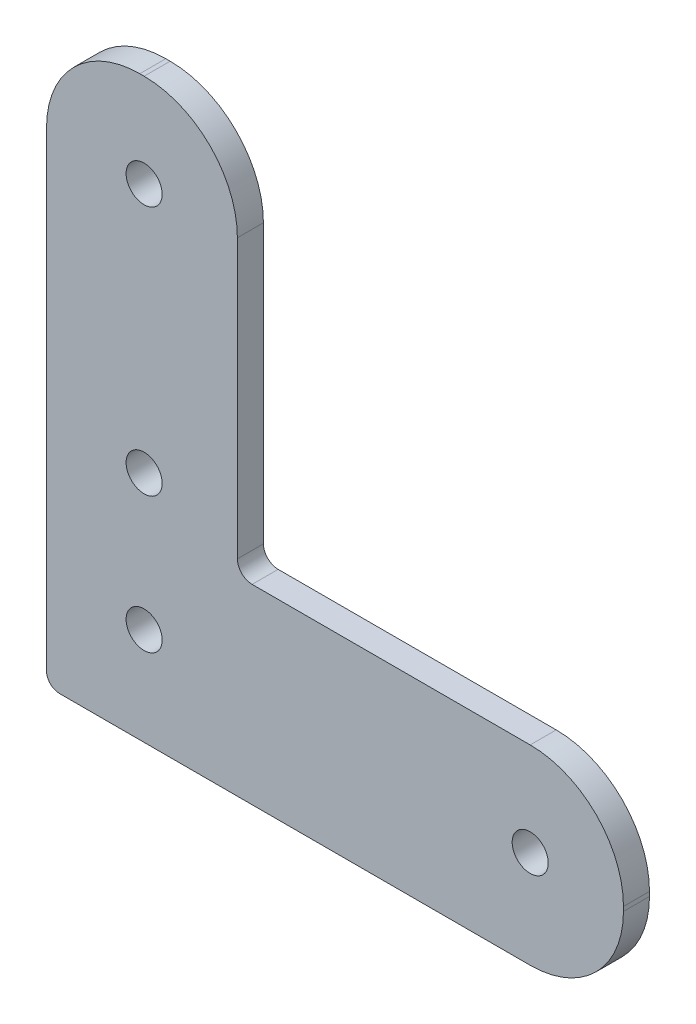
ISO-10303-21;
HEADER;
FILE_DESCRIPTION(('STEP AP214'),'2;1');
FILE_NAME('part.step','',(''),(''),'','','');
FILE_SCHEMA(('AUTOMOTIVE_DESIGN { 1 0 10303 214 1 1 1 1 }'));
ENDSEC;
DATA;
#1=APPLICATION_CONTEXT('core data for automotive mechanical design processes');
#2=APPLICATION_PROTOCOL_DEFINITION('international standard','automotive_design',2000,#1);
#3=PRODUCT_CONTEXT('',#1,'mechanical');
#4=PRODUCT('Part','Part','',(#3));
#5=PRODUCT_RELATED_PRODUCT_CATEGORY('part','',(#4));
#6=PRODUCT_DEFINITION_FORMATION('','',#4);
#7=PRODUCT_DEFINITION_CONTEXT('part definition',#1,'design');
#8=PRODUCT_DEFINITION('design','',#6,#7);
#9=PRODUCT_DEFINITION_SHAPE('','',#8);
#10=(LENGTH_UNIT() NAMED_UNIT(*) SI_UNIT(.MILLI.,.METRE.));
#11=(NAMED_UNIT(*) PLANE_ANGLE_UNIT() SI_UNIT($,.RADIAN.));
#12=(NAMED_UNIT(*) SI_UNIT($,.STERADIAN.) SOLID_ANGLE_UNIT());
#13=UNCERTAINTY_MEASURE_WITH_UNIT(LENGTH_MEASURE(1.E-05),#10,'distance_accuracy_value','');
#14=(GEOMETRIC_REPRESENTATION_CONTEXT(3) GLOBAL_UNCERTAINTY_ASSIGNED_CONTEXT((#13)) GLOBAL_UNIT_ASSIGNED_CONTEXT((#10,
#11,#12)) REPRESENTATION_CONTEXT('',''));
#15=CARTESIAN_POINT('',(0.,0.,0.));
#16=DIRECTION('',(0.,0.,1.));
#17=DIRECTION('',(1.,0.,0.));
#18=AXIS2_PLACEMENT_3D('',#15,#16,#17);
#19=CARTESIAN_POINT('',(0.,44.,3.));
#20=DIRECTION('',(0.,1.,0.));
#21=DIRECTION('',(0.,0.,1.));
#22=AXIS2_PLACEMENT_3D('',#19,#20,#21);
#23=PLANE('',#22);
#24=DIRECTION('',(1.,0.,0.));
#25=VECTOR('',#24,1.);
#26=CARTESIAN_POINT('',(0.,44.,-3.));
#27=LINE('',#26,#25);
#28=CARTESIAN_POINT('',(47.4,44.,-3.));
#29=VERTEX_POINT('',#28);
#30=CARTESIAN_POINT('',(111.5,44.,-3.));
#31=VERTEX_POINT('',#30);
#32=EDGE_CURVE('E128',#29,#31,#27,.T.);
#33=ORIENTED_EDGE('',*,*,#32,.F.);
#34=DIRECTION('',(0.,0.,-1.));
#35=VECTOR('',#34,1.);
#36=CARTESIAN_POINT('',(47.4,44.,3.));
#37=LINE('',#36,#35);
#38=CARTESIAN_POINT('',(47.4,44.,3.));
#39=VERTEX_POINT('',#38);
#40=EDGE_CURVE('E196',#29,#39,#37,.F.);
#41=ORIENTED_EDGE('',*,*,#40,.T.);
#42=DIRECTION('',(1.,0.,0.));
#43=VECTOR('',#42,1.);
#44=CARTESIAN_POINT('',(0.,44.,3.));
#45=LINE('',#44,#43);
#46=CARTESIAN_POINT('',(111.5,44.,3.));
#47=VERTEX_POINT('',#46);
#48=EDGE_CURVE('E153',#39,#47,#45,.T.);
#49=ORIENTED_EDGE('',*,*,#48,.T.);
#50=DIRECTION('',(0.,0.,-1.));
#51=VECTOR('',#50,1.);
#52=CARTESIAN_POINT('',(111.5,44.,3.));
#53=LINE('',#52,#51);
#54=EDGE_CURVE('E147',#47,#31,#53,.T.);
#55=ORIENTED_EDGE('',*,*,#54,.T.);
#56=EDGE_LOOP('',(#33,#41,#49,#55));
#57=FACE_BOUND('',#56,.T.);
#58=ADVANCED_FACE('F43',(#57),#23,.T.);
#59=CARTESIAN_POINT('',(44.,0.,3.));
#60=DIRECTION('',(1.,0.,0.));
#61=DIRECTION('',(0.,1.,0.));
#62=AXIS2_PLACEMENT_3D('',#59,#60,#61);
#63=PLANE('',#62);
#64=DIRECTION('',(0.,-1.,0.));
#65=VECTOR('',#64,1.);
#66=CARTESIAN_POINT('',(44.,0.,3.));
#67=LINE('',#66,#65);
#68=CARTESIAN_POINT('',(44.,111.5,3.));
#69=VERTEX_POINT('',#68);
#70=CARTESIAN_POINT('',(44.,47.4,3.));
#71=VERTEX_POINT('',#70);
#72=EDGE_CURVE('E227',#69,#71,#67,.T.);
#73=ORIENTED_EDGE('',*,*,#72,.T.);
#74=DIRECTION('',(0.,0.,-1.));
#75=VECTOR('',#74,1.);
#76=CARTESIAN_POINT('',(44.,47.4,-3.));
#77=LINE('',#76,#75);
#78=CARTESIAN_POINT('',(44.,47.4,-3.));
#79=VERTEX_POINT('',#78);
#80=EDGE_CURVE('E193',#71,#79,#77,.T.);
#81=ORIENTED_EDGE('',*,*,#80,.T.);
#82=DIRECTION('',(0.,-1.,0.));
#83=VECTOR('',#82,1.);
#84=CARTESIAN_POINT('',(44.,0.,-3.));
#85=LINE('',#84,#83);
#86=CARTESIAN_POINT('',(44.,111.5,-3.));
#87=VERTEX_POINT('',#86);
#88=EDGE_CURVE('E139',#87,#79,#85,.T.);
#89=ORIENTED_EDGE('',*,*,#88,.F.);
#90=DIRECTION('',(0.,0.,-1.));
#91=VECTOR('',#90,1.);
#92=CARTESIAN_POINT('',(44.,111.5,3.));
#93=LINE('',#92,#91);
#94=EDGE_CURVE('E188',#87,#69,#93,.F.);
#95=ORIENTED_EDGE('',*,*,#94,.T.);
#96=EDGE_LOOP('',(#73,#81,#89,#95));
#97=FACE_BOUND('',#96,.T.);
#98=ADVANCED_FACE('F284',(#97),#63,.T.);
#99=CARTESIAN_POINT('',(0.,133.,3.));
#100=DIRECTION('',(0.,-1.,0.));
#101=DIRECTION('',(0.,0.,-1.));
#102=AXIS2_PLACEMENT_3D('',#99,#100,#101);
#103=PLANE('',#102);
#104=DIRECTION('',(-1.,0.,0.));
#105=VECTOR('',#104,1.);
#106=CARTESIAN_POINT('',(0.,133.,3.));
#107=LINE('',#106,#105);
#108=CARTESIAN_POINT('',(22.5,133.,3.));
#109=VERTEX_POINT('',#108);
#110=CARTESIAN_POINT('',(21.5,133.,3.));
#111=VERTEX_POINT('',#110);
#112=EDGE_CURVE('E224',#109,#111,#107,.T.);
#113=ORIENTED_EDGE('',*,*,#112,.F.);
#114=DIRECTION('',(0.,0.,-1.));
#115=VECTOR('',#114,1.);
#116=CARTESIAN_POINT('',(22.5,133.,-3.));
#117=LINE('',#116,#115);
#118=CARTESIAN_POINT('',(22.5,133.,-3.));
#119=VERTEX_POINT('',#118);
#120=EDGE_CURVE('E185',#109,#119,#117,.T.);
#121=ORIENTED_EDGE('',*,*,#120,.T.);
#122=DIRECTION('',(-1.,0.,0.));
#123=VECTOR('',#122,1.);
#124=CARTESIAN_POINT('',(0.,133.,-3.));
#125=LINE('',#124,#123);
#126=CARTESIAN_POINT('',(21.5,133.,-3.));
#127=VERTEX_POINT('',#126);
#128=EDGE_CURVE('E215',#119,#127,#125,.T.);
#129=ORIENTED_EDGE('',*,*,#128,.T.);
#130=DIRECTION('',(0.,0.,-1.));
#131=VECTOR('',#130,1.);
#132=CARTESIAN_POINT('',(21.5,133.,3.));
#133=LINE('',#132,#131);
#134=EDGE_CURVE('E183',#127,#111,#133,.F.);
#135=ORIENTED_EDGE('',*,*,#134,.T.);
#136=EDGE_LOOP('',(#113,#121,#129,#135));
#137=FACE_BOUND('',#136,.T.);
#138=ADVANCED_FACE('F290',(#137),#103,.F.);
#139=CARTESIAN_POINT('',(0.,0.,3.));
#140=DIRECTION('',(-1.,0.,0.));
#141=DIRECTION('',(0.,0.,1.));
#142=AXIS2_PLACEMENT_3D('',#139,#140,#141);
#143=PLANE('',#142);
#144=DIRECTION('',(0.,1.,0.));
#145=VECTOR('',#144,1.);
#146=CARTESIAN_POINT('',(0.,0.,-3.));
#147=LINE('',#146,#145);
#148=CARTESIAN_POINT('',(0.,3.,-3.));
#149=VERTEX_POINT('',#148);
#150=CARTESIAN_POINT('',(0.,111.5,-3.));
#151=VERTEX_POINT('',#150);
#152=EDGE_CURVE('E214',#149,#151,#147,.T.);
#153=ORIENTED_EDGE('',*,*,#152,.F.);
#154=DIRECTION('',(0.,0.,-1.));
#155=VECTOR('',#154,1.);
#156=CARTESIAN_POINT('',(0.,3.,3.));
#157=LINE('',#156,#155);
#158=CARTESIAN_POINT('',(0.,3.,3.));
#159=VERTEX_POINT('',#158);
#160=EDGE_CURVE('E51',#149,#159,#157,.F.);
#161=ORIENTED_EDGE('',*,*,#160,.T.);
#162=DIRECTION('',(0.,1.,0.));
#163=VECTOR('',#162,1.);
#164=CARTESIAN_POINT('',(0.,0.,3.));
#165=LINE('',#164,#163);
#166=CARTESIAN_POINT('',(0.,111.5,3.));
#167=VERTEX_POINT('',#166);
#168=EDGE_CURVE('E222',#159,#167,#165,.T.);
#169=ORIENTED_EDGE('',*,*,#168,.T.);
#170=DIRECTION('',(0.,0.,-1.));
#171=VECTOR('',#170,1.);
#172=CARTESIAN_POINT('',(0.,111.5,-3.));
#173=LINE('',#172,#171);
#174=EDGE_CURVE('E190',#167,#151,#173,.T.);
#175=ORIENTED_EDGE('',*,*,#174,.T.);
#176=EDGE_LOOP('',(#153,#161,#169,#175));
#177=FACE_BOUND('',#176,.T.);
#178=ADVANCED_FACE('F310',(#177),#143,.T.);
#179=CARTESIAN_POINT('',(0.,0.,3.));
#180=DIRECTION('',(0.,-1.,0.));
#181=DIRECTION('',(1.,0.,0.));
#182=AXIS2_PLACEMENT_3D('',#179,#180,#181);
#183=PLANE('',#182);
#184=DIRECTION('',(-1.,0.,0.));
#185=VECTOR('',#184,1.);
#186=CARTESIAN_POINT('',(0.,0.,3.));
#187=LINE('',#186,#185);
#188=CARTESIAN_POINT('',(111.5,0.,3.));
#189=VERTEX_POINT('',#188);
#190=CARTESIAN_POINT('',(3.,0.,3.));
#191=VERTEX_POINT('',#190);
#192=EDGE_CURVE('E161',#189,#191,#187,.T.);
#193=ORIENTED_EDGE('',*,*,#192,.T.);
#194=DIRECTION('',(0.,0.,-1.));
#195=VECTOR('',#194,1.);
#196=CARTESIAN_POINT('',(3.,0.,3.));
#197=LINE('',#196,#195);
#198=CARTESIAN_POINT('',(3.,0.,-3.));
#199=VERTEX_POINT('',#198);
#200=EDGE_CURVE('E201',#191,#199,#197,.T.);
#201=ORIENTED_EDGE('',*,*,#200,.T.);
#202=DIRECTION('',(-1.,0.,0.));
#203=VECTOR('',#202,1.);
#204=CARTESIAN_POINT('',(0.,0.,-3.));
#205=LINE('',#204,#203);
#206=CARTESIAN_POINT('',(111.5,0.,-3.));
#207=VERTEX_POINT('',#206);
#208=EDGE_CURVE('E209',#207,#199,#205,.T.);
#209=ORIENTED_EDGE('',*,*,#208,.F.);
#210=DIRECTION('',(0.,0.,-1.));
#211=VECTOR('',#210,1.);
#212=CARTESIAN_POINT('',(111.5,0.,3.));
#213=LINE('',#212,#211);
#214=EDGE_CURVE('E181',#207,#189,#213,.F.);
#215=ORIENTED_EDGE('',*,*,#214,.T.);
#216=EDGE_LOOP('',(#193,#201,#209,#215));
#217=FACE_BOUND('',#216,.T.);
#218=ADVANCED_FACE('F208',(#217),#183,.T.);
#219=CARTESIAN_POINT('',(133.,0.,3.));
#220=DIRECTION('',(1.,0.,0.));
#221=DIRECTION('',(0.,0.,-1.));
#222=AXIS2_PLACEMENT_3D('',#219,#220,#221);
#223=PLANE('',#222);
#224=DIRECTION('',(0.,-1.,0.));
#225=VECTOR('',#224,1.);
#226=CARTESIAN_POINT('',(133.,0.,-3.));
#227=LINE('',#226,#225);
#228=CARTESIAN_POINT('',(133.,22.5,-3.));
#229=VERTEX_POINT('',#228);
#230=CARTESIAN_POINT('',(133.,21.5,-3.));
#231=VERTEX_POINT('',#230);
#232=EDGE_CURVE('E164',#229,#231,#227,.T.);
#233=ORIENTED_EDGE('',*,*,#232,.F.);
#234=DIRECTION('',(0.,0.,-1.));
#235=VECTOR('',#234,1.);
#236=CARTESIAN_POINT('',(133.,22.5,3.));
#237=LINE('',#236,#235);
#238=CARTESIAN_POINT('',(133.,22.5,3.));
#239=VERTEX_POINT('',#238);
#240=EDGE_CURVE('E148',#229,#239,#237,.F.);
#241=ORIENTED_EDGE('',*,*,#240,.T.);
#242=DIRECTION('',(0.,-1.,0.));
#243=VECTOR('',#242,1.);
#244=CARTESIAN_POINT('',(133.,0.,3.));
#245=LINE('',#244,#243);
#246=CARTESIAN_POINT('',(133.,21.5,3.));
#247=VERTEX_POINT('',#246);
#248=EDGE_CURVE('E156',#239,#247,#245,.T.);
#249=ORIENTED_EDGE('',*,*,#248,.T.);
#250=DIRECTION('',(0.,0.,-1.));
#251=VECTOR('',#250,1.);
#252=CARTESIAN_POINT('',(133.,21.5,3.));
#253=LINE('',#252,#251);
#254=EDGE_CURVE('E149',#247,#231,#253,.T.);
#255=ORIENTED_EDGE('',*,*,#254,.T.);
#256=EDGE_LOOP('',(#233,#241,#249,#255));
#257=FACE_BOUND('',#256,.T.);
#258=ADVANCED_FACE('F260',(#257),#223,.T.);
#259=CARTESIAN_POINT('',(0.,0.,3.));
#260=DIRECTION('',(0.,0.,1.));
#261=DIRECTION('',(1.,0.,0.));
#262=AXIS2_PLACEMENT_3D('',#259,#260,#261);
#263=PLANE('',#262);
#264=CARTESIAN_POINT('',(22.5,111.5,3.));
#265=DIRECTION('',(0.,0.,1.));
#266=DIRECTION('',(1.,0.,0.));
#267=AXIS2_PLACEMENT_3D('',#264,#265,#266);
#268=CIRCLE('',#267,4.15925);
#269=CARTESIAN_POINT('',(26.65925,111.5,3.));
#270=VERTEX_POINT('',#269);
#271=EDGE_CURVE('E251',#270,#270,#268,.T.);
#272=ORIENTED_EDGE('',*,*,#271,.F.);
#273=EDGE_LOOP('',(#272));
#274=FACE_BOUND('',#273,.T.);
#275=CARTESIAN_POINT('',(22.5,53.7884,3.));
#276=DIRECTION('',(0.,0.,1.));
#277=DIRECTION('',(1.,0.,0.));
#278=AXIS2_PLACEMENT_3D('',#275,#276,#277);
#279=CIRCLE('',#278,4.15925);
#280=CARTESIAN_POINT('',(26.65925,53.7884,3.));
#281=VERTEX_POINT('',#280);
#282=EDGE_CURVE('E245',#281,#281,#279,.T.);
#283=ORIENTED_EDGE('',*,*,#282,.F.);
#284=EDGE_LOOP('',(#283));
#285=FACE_BOUND('',#284,.T.);
#286=CARTESIAN_POINT('',(22.5,22.5,3.));
#287=DIRECTION('',(0.,0.,1.));
#288=DIRECTION('',(1.,0.,0.));
#289=AXIS2_PLACEMENT_3D('',#286,#287,#288);
#290=CIRCLE('',#289,4.15925);
#291=CARTESIAN_POINT('',(26.65925,22.5,3.));
#292=VERTEX_POINT('',#291);
#293=EDGE_CURVE('E239',#292,#292,#290,.T.);
#294=ORIENTED_EDGE('',*,*,#293,.F.);
#295=EDGE_LOOP('',(#294));
#296=FACE_BOUND('',#295,.T.);
#297=CARTESIAN_POINT('',(111.5,22.5,3.));
#298=DIRECTION('',(0.,0.,1.));
#299=DIRECTION('',(1.,0.,0.));
#300=AXIS2_PLACEMENT_3D('',#297,#298,#299);
#301=CIRCLE('',#300,4.15925);
#302=CARTESIAN_POINT('',(115.65925,22.5,3.));
#303=VERTEX_POINT('',#302);
#304=EDGE_CURVE('E233',#303,#303,#301,.T.);
#305=ORIENTED_EDGE('',*,*,#304,.F.);
#306=EDGE_LOOP('',(#305));
#307=FACE_BOUND('',#306,.T.);
#308=ORIENTED_EDGE('',*,*,#168,.F.);
#309=CARTESIAN_POINT('',(3.,3.,3.));
#310=DIRECTION('',(0.,0.,1.));
#311=DIRECTION('',(1.,0.,0.));
#312=AXIS2_PLACEMENT_3D('',#309,#310,#311);
#313=CIRCLE('',#312,3.);
#314=EDGE_CURVE('E11',#159,#191,#313,.T.);
#315=ORIENTED_EDGE('',*,*,#314,.T.);
#316=ORIENTED_EDGE('',*,*,#192,.F.);
#317=CARTESIAN_POINT('',(111.5,21.5,3.));
#318=DIRECTION('',(0.,0.,1.));
#319=DIRECTION('',(1.,0.,0.));
#320=AXIS2_PLACEMENT_3D('',#317,#318,#319);
#321=CIRCLE('',#320,21.5);
#322=EDGE_CURVE('E177',#189,#247,#321,.T.);
#323=ORIENTED_EDGE('',*,*,#322,.T.);
#324=ORIENTED_EDGE('',*,*,#248,.F.);
#325=CARTESIAN_POINT('',(111.5,22.5,3.));
#326=DIRECTION('',(0.,0.,1.));
#327=DIRECTION('',(1.,0.,0.));
#328=AXIS2_PLACEMENT_3D('',#325,#326,#327);
#329=CIRCLE('',#328,21.5);
#330=EDGE_CURVE('E179',#239,#47,#329,.T.);
#331=ORIENTED_EDGE('',*,*,#330,.T.);
#332=ORIENTED_EDGE('',*,*,#48,.F.);
#333=CARTESIAN_POINT('',(47.4,47.4,3.));
#334=DIRECTION('',(0.,0.,1.));
#335=DIRECTION('',(1.,0.,0.));
#336=AXIS2_PLACEMENT_3D('',#333,#334,#335);
#337=CIRCLE('',#336,3.4);
#338=EDGE_CURVE('E199',#39,#71,#337,.F.);
#339=ORIENTED_EDGE('',*,*,#338,.T.);
#340=ORIENTED_EDGE('',*,*,#72,.F.);
#341=CARTESIAN_POINT('',(22.5,111.5,3.));
#342=DIRECTION('',(0.,0.,1.));
#343=DIRECTION('',(1.,0.,0.));
#344=AXIS2_PLACEMENT_3D('',#341,#342,#343);
#345=CIRCLE('',#344,21.5);
#346=EDGE_CURVE('E175',#69,#109,#345,.T.);
#347=ORIENTED_EDGE('',*,*,#346,.T.);
#348=ORIENTED_EDGE('',*,*,#112,.T.);
#349=CARTESIAN_POINT('',(21.5,111.5,3.));
#350=DIRECTION('',(0.,0.,1.));
#351=DIRECTION('',(1.,0.,0.));
#352=AXIS2_PLACEMENT_3D('',#349,#350,#351);
#353=CIRCLE('',#352,21.5);
#354=EDGE_CURVE('E172',#111,#167,#353,.T.);
#355=ORIENTED_EDGE('',*,*,#354,.T.);
#356=EDGE_LOOP('',(#308,#315,#316,#323,#324,#331,#332,#339,#340,#347,#348,#355));
#357=FACE_BOUND('',#356,.T.);
#358=ADVANCED_FACE('F257',(#274,#285,#296,#307,#357),#263,.T.);
#359=CARTESIAN_POINT('',(0.,0.,-3.));
#360=DIRECTION('',(0.,0.,1.));
#361=DIRECTION('',(1.,0.,0.));
#362=AXIS2_PLACEMENT_3D('',#359,#360,#361);
#363=PLANE('',#362);
#364=CARTESIAN_POINT('',(22.5,111.5,-3.));
#365=DIRECTION('',(0.,0.,1.));
#366=DIRECTION('',(1.,0.,0.));
#367=AXIS2_PLACEMENT_3D('',#364,#365,#366);
#368=CIRCLE('',#367,4.15925);
#369=CARTESIAN_POINT('',(26.65925,111.5,-3.));
#370=VERTEX_POINT('',#369);
#371=EDGE_CURVE('E248',#370,#370,#368,.T.);
#372=ORIENTED_EDGE('',*,*,#371,.T.);
#373=EDGE_LOOP('',(#372));
#374=FACE_BOUND('',#373,.T.);
#375=CARTESIAN_POINT('',(22.5,53.7884,-3.));
#376=DIRECTION('',(0.,0.,1.));
#377=DIRECTION('',(1.,0.,0.));
#378=AXIS2_PLACEMENT_3D('',#375,#376,#377);
#379=CIRCLE('',#378,4.15925);
#380=CARTESIAN_POINT('',(26.65925,53.7884,-3.));
#381=VERTEX_POINT('',#380);
#382=EDGE_CURVE('E242',#381,#381,#379,.T.);
#383=ORIENTED_EDGE('',*,*,#382,.T.);
#384=EDGE_LOOP('',(#383));
#385=FACE_BOUND('',#384,.T.);
#386=CARTESIAN_POINT('',(22.5,22.5,-3.));
#387=DIRECTION('',(0.,0.,1.));
#388=DIRECTION('',(1.,0.,0.));
#389=AXIS2_PLACEMENT_3D('',#386,#387,#388);
#390=CIRCLE('',#389,4.15925);
#391=CARTESIAN_POINT('',(26.65925,22.5,-3.));
#392=VERTEX_POINT('',#391);
#393=EDGE_CURVE('E236',#392,#392,#390,.T.);
#394=ORIENTED_EDGE('',*,*,#393,.T.);
#395=EDGE_LOOP('',(#394));
#396=FACE_BOUND('',#395,.T.);
#397=CARTESIAN_POINT('',(111.5,22.5,-3.));
#398=DIRECTION('',(0.,0.,1.));
#399=DIRECTION('',(1.,0.,0.));
#400=AXIS2_PLACEMENT_3D('',#397,#398,#399);
#401=CIRCLE('',#400,4.15925);
#402=CARTESIAN_POINT('',(115.65925,22.5,-3.));
#403=VERTEX_POINT('',#402);
#404=EDGE_CURVE('E140',#403,#403,#401,.T.);
#405=ORIENTED_EDGE('',*,*,#404,.T.);
#406=EDGE_LOOP('',(#405));
#407=FACE_BOUND('',#406,.T.);
#408=ORIENTED_EDGE('',*,*,#208,.T.);
#409=CARTESIAN_POINT('',(3.,3.,-3.));
#410=DIRECTION('',(0.,0.,1.));
#411=DIRECTION('',(1.,0.,0.));
#412=AXIS2_PLACEMENT_3D('',#409,#410,#411);
#413=CIRCLE('',#412,3.);
#414=EDGE_CURVE('E65',#199,#149,#413,.F.);
#415=ORIENTED_EDGE('',*,*,#414,.T.);
#416=ORIENTED_EDGE('',*,*,#152,.T.);
#417=CARTESIAN_POINT('',(21.5,111.5,-3.));
#418=DIRECTION('',(0.,0.,1.));
#419=DIRECTION('',(1.,0.,0.));
#420=AXIS2_PLACEMENT_3D('',#417,#418,#419);
#421=CIRCLE('',#420,21.5);
#422=EDGE_CURVE('E155',#151,#127,#421,.F.);
#423=ORIENTED_EDGE('',*,*,#422,.T.);
#424=ORIENTED_EDGE('',*,*,#128,.F.);
#425=CARTESIAN_POINT('',(22.5,111.5,-3.));
#426=DIRECTION('',(0.,0.,1.));
#427=DIRECTION('',(1.,0.,0.));
#428=AXIS2_PLACEMENT_3D('',#425,#426,#427);
#429=CIRCLE('',#428,21.5);
#430=EDGE_CURVE('E158',#119,#87,#429,.F.);
#431=ORIENTED_EDGE('',*,*,#430,.T.);
#432=ORIENTED_EDGE('',*,*,#88,.T.);
#433=CARTESIAN_POINT('',(47.4,47.4,-3.));
#434=DIRECTION('',(0.,0.,1.));
#435=DIRECTION('',(1.,0.,0.));
#436=AXIS2_PLACEMENT_3D('',#433,#434,#435);
#437=CIRCLE('',#436,3.4);
#438=EDGE_CURVE('E135',#79,#29,#437,.T.);
#439=ORIENTED_EDGE('',*,*,#438,.T.);
#440=ORIENTED_EDGE('',*,*,#32,.T.);
#441=CARTESIAN_POINT('',(111.5,22.5,-3.));
#442=DIRECTION('',(0.,0.,1.));
#443=DIRECTION('',(1.,0.,0.));
#444=AXIS2_PLACEMENT_3D('',#441,#442,#443);
#445=CIRCLE('',#444,21.5);
#446=EDGE_CURVE('E132',#31,#229,#445,.F.);
#447=ORIENTED_EDGE('',*,*,#446,.T.);
#448=ORIENTED_EDGE('',*,*,#232,.T.);
#449=CARTESIAN_POINT('',(111.5,21.5,-3.));
#450=DIRECTION('',(0.,0.,1.));
#451=DIRECTION('',(1.,0.,0.));
#452=AXIS2_PLACEMENT_3D('',#449,#450,#451);
#453=CIRCLE('',#452,21.5);
#454=EDGE_CURVE('E150',#231,#207,#453,.F.);
#455=ORIENTED_EDGE('',*,*,#454,.T.);
#456=EDGE_LOOP('',(#408,#415,#416,#423,#424,#431,#432,#439,#440,#447,#448,#455));
#457=FACE_BOUND('',#456,.T.);
#458=ADVANCED_FACE('F130',(#374,#385,#396,#407,#457),#363,.F.);
#459=CARTESIAN_POINT('',(111.5,22.5,3.));
#460=DIRECTION('',(0.,0.,-1.));
#461=DIRECTION('',(-1.,0.,0.));
#462=AXIS2_PLACEMENT_3D('',#459,#460,#461);
#463=CYLINDRICAL_SURFACE('',#462,21.5);
#464=ORIENTED_EDGE('',*,*,#330,.F.);
#465=ORIENTED_EDGE('',*,*,#240,.F.);
#466=ORIENTED_EDGE('',*,*,#446,.F.);
#467=ORIENTED_EDGE('',*,*,#54,.F.);
#468=EDGE_LOOP('',(#464,#465,#466,#467));
#469=FACE_BOUND('',#468,.T.);
#470=ADVANCED_FACE('F146',(#469),#463,.T.);
#471=CARTESIAN_POINT('',(111.5,21.5,3.));
#472=DIRECTION('',(0.,0.,-1.));
#473=DIRECTION('',(-1.,0.,0.));
#474=AXIS2_PLACEMENT_3D('',#471,#472,#473);
#475=CYLINDRICAL_SURFACE('',#474,21.5);
#476=ORIENTED_EDGE('',*,*,#322,.F.);
#477=ORIENTED_EDGE('',*,*,#214,.F.);
#478=ORIENTED_EDGE('',*,*,#454,.F.);
#479=ORIENTED_EDGE('',*,*,#254,.F.);
#480=EDGE_LOOP('',(#476,#477,#478,#479));
#481=FACE_BOUND('',#480,.T.);
#482=ADVANCED_FACE('F297',(#481),#475,.T.);
#483=CARTESIAN_POINT('',(22.5,111.5,3.));
#484=DIRECTION('',(0.,0.,1.));
#485=DIRECTION('',(1.,0.,0.));
#486=AXIS2_PLACEMENT_3D('',#483,#484,#485);
#487=CYLINDRICAL_SURFACE('',#486,21.5);
#488=ORIENTED_EDGE('',*,*,#346,.F.);
#489=ORIENTED_EDGE('',*,*,#94,.F.);
#490=ORIENTED_EDGE('',*,*,#430,.F.);
#491=ORIENTED_EDGE('',*,*,#120,.F.);
#492=EDGE_LOOP('',(#488,#489,#490,#491));
#493=FACE_BOUND('',#492,.T.);
#494=ADVANCED_FACE('F300',(#493),#487,.T.);
#495=CARTESIAN_POINT('',(21.5,111.5,3.));
#496=DIRECTION('',(0.,0.,1.));
#497=DIRECTION('',(1.,0.,0.));
#498=AXIS2_PLACEMENT_3D('',#495,#496,#497);
#499=CYLINDRICAL_SURFACE('',#498,21.5);
#500=ORIENTED_EDGE('',*,*,#354,.F.);
#501=ORIENTED_EDGE('',*,*,#134,.F.);
#502=ORIENTED_EDGE('',*,*,#422,.F.);
#503=ORIENTED_EDGE('',*,*,#174,.F.);
#504=EDGE_LOOP('',(#500,#501,#502,#503));
#505=FACE_BOUND('',#504,.T.);
#506=ADVANCED_FACE('F281',(#505),#499,.T.);
#507=CARTESIAN_POINT('',(47.4,47.4,3.));
#508=DIRECTION('',(0.,0.,1.));
#509=DIRECTION('',(1.,0.,0.));
#510=AXIS2_PLACEMENT_3D('',#507,#508,#509);
#511=CYLINDRICAL_SURFACE('',#510,3.4);
#512=ORIENTED_EDGE('',*,*,#338,.F.);
#513=ORIENTED_EDGE('',*,*,#40,.F.);
#514=ORIENTED_EDGE('',*,*,#438,.F.);
#515=ORIENTED_EDGE('',*,*,#80,.F.);
#516=EDGE_LOOP('',(#512,#513,#514,#515));
#517=FACE_BOUND('',#516,.T.);
#518=ADVANCED_FACE('F272',(#517),#511,.F.);
#519=CARTESIAN_POINT('',(3.,3.,3.));
#520=DIRECTION('',(0.,0.,-1.));
#521=DIRECTION('',(-1.,0.,0.));
#522=AXIS2_PLACEMENT_3D('',#519,#520,#521);
#523=CYLINDRICAL_SURFACE('',#522,3.);
#524=ORIENTED_EDGE('',*,*,#314,.F.);
#525=ORIENTED_EDGE('',*,*,#160,.F.);
#526=ORIENTED_EDGE('',*,*,#414,.F.);
#527=ORIENTED_EDGE('',*,*,#200,.F.);
#528=EDGE_LOOP('',(#524,#525,#526,#527));
#529=FACE_BOUND('',#528,.T.);
#530=ADVANCED_FACE('F45',(#529),#523,.T.);
#531=CARTESIAN_POINT('',(111.5,22.5,3.));
#532=DIRECTION('',(0.,0.,1.));
#533=DIRECTION('',(1.,0.,0.));
#534=AXIS2_PLACEMENT_3D('',#531,#532,#533);
#535=CYLINDRICAL_SURFACE('',#534,4.15925);
#536=ORIENTED_EDGE('',*,*,#404,.F.);
#537=EDGE_LOOP('',(#536));
#538=FACE_BOUND('',#537,.T.);
#539=ORIENTED_EDGE('',*,*,#304,.T.);
#540=EDGE_LOOP('',(#539));
#541=FACE_BOUND('',#540,.T.);
#542=ADVANCED_FACE('F271',(#538,#541),#535,.F.);
#543=CARTESIAN_POINT('',(22.5,22.5,3.));
#544=DIRECTION('',(0.,0.,1.));
#545=DIRECTION('',(1.,0.,0.));
#546=AXIS2_PLACEMENT_3D('',#543,#544,#545);
#547=CYLINDRICAL_SURFACE('',#546,4.15925);
#548=ORIENTED_EDGE('',*,*,#393,.F.);
#549=EDGE_LOOP('',(#548));
#550=FACE_BOUND('',#549,.T.);
#551=ORIENTED_EDGE('',*,*,#293,.T.);
#552=EDGE_LOOP('',(#551));
#553=FACE_BOUND('',#552,.T.);
#554=ADVANCED_FACE('F277',(#550,#553),#547,.F.);
#555=CARTESIAN_POINT('',(22.5,53.7884,3.));
#556=DIRECTION('',(0.,0.,1.));
#557=DIRECTION('',(1.,0.,0.));
#558=AXIS2_PLACEMENT_3D('',#555,#556,#557);
#559=CYLINDRICAL_SURFACE('',#558,4.15925);
#560=ORIENTED_EDGE('',*,*,#382,.F.);
#561=EDGE_LOOP('',(#560));
#562=FACE_BOUND('',#561,.T.);
#563=ORIENTED_EDGE('',*,*,#282,.T.);
#564=EDGE_LOOP('',(#563));
#565=FACE_BOUND('',#564,.T.);
#566=ADVANCED_FACE('F418',(#562,#565),#559,.F.);
#567=CARTESIAN_POINT('',(22.5,111.5,3.));
#568=DIRECTION('',(0.,0.,1.));
#569=DIRECTION('',(1.,0.,0.));
#570=AXIS2_PLACEMENT_3D('',#567,#568,#569);
#571=CYLINDRICAL_SURFACE('',#570,4.15925);
#572=ORIENTED_EDGE('',*,*,#371,.F.);
#573=EDGE_LOOP('',(#572));
#574=FACE_BOUND('',#573,.T.);
#575=ORIENTED_EDGE('',*,*,#271,.T.);
#576=EDGE_LOOP('',(#575));
#577=FACE_BOUND('',#576,.T.);
#578=ADVANCED_FACE('F255',(#574,#577),#571,.F.);
#579=CLOSED_SHELL('',(#58,#98,#138,#178,#218,#258,#358,#458,#470,#482,#494,#506,#518,#530,#542,
#554,#566,#578));
#580=MANIFOLD_SOLID_BREP('B2',#579);
#581=ADVANCED_BREP_SHAPE_REPRESENTATION('',(#18,#580),#14);
#582=SHAPE_DEFINITION_REPRESENTATION(#9,#581);
ENDSEC;
END-ISO-10303-21;
